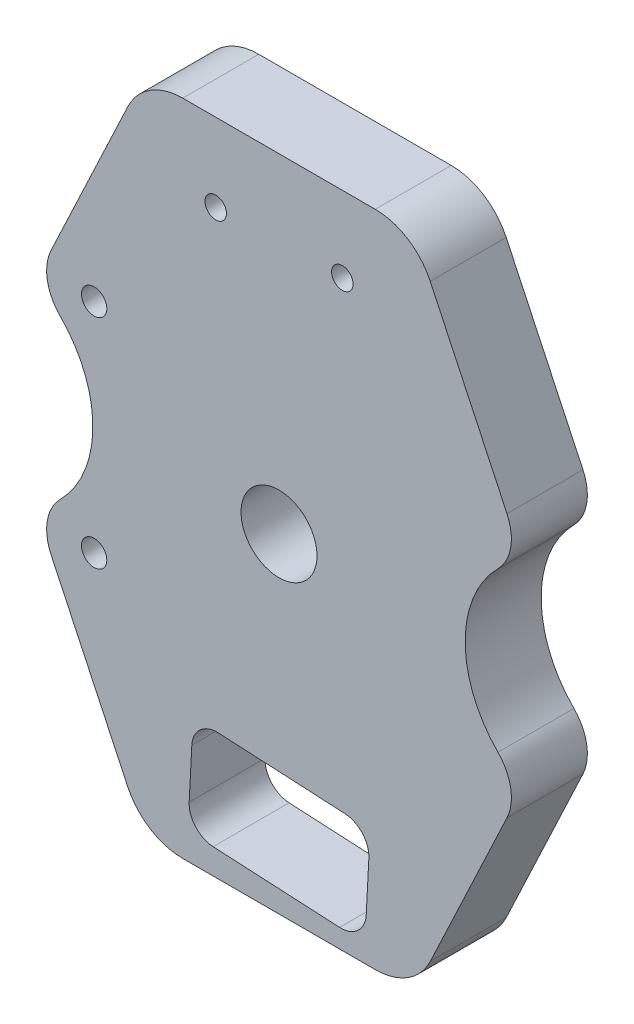
ISO-10303-21;
HEADER;
FILE_DESCRIPTION(('STEP AP214'),'2;1');
FILE_NAME('part.step','',(''),(''),'','','');
FILE_SCHEMA(('AUTOMOTIVE_DESIGN { 1 0 10303 214 1 1 1 1 }'));
ENDSEC;
DATA;
#1=APPLICATION_CONTEXT('core data for automotive mechanical design processes');
#2=APPLICATION_PROTOCOL_DEFINITION('international standard','automotive_design',2000,#1);
#3=PRODUCT_CONTEXT('',#1,'mechanical');
#4=PRODUCT('Part','Part','',(#3));
#5=PRODUCT_RELATED_PRODUCT_CATEGORY('part','',(#4));
#6=PRODUCT_DEFINITION_FORMATION('','',#4);
#7=PRODUCT_DEFINITION_CONTEXT('part definition',#1,'design');
#8=PRODUCT_DEFINITION('design','',#6,#7);
#9=PRODUCT_DEFINITION_SHAPE('','',#8);
#10=(LENGTH_UNIT() NAMED_UNIT(*) SI_UNIT(.MILLI.,.METRE.));
#11=(NAMED_UNIT(*) PLANE_ANGLE_UNIT() SI_UNIT($,.RADIAN.));
#12=(NAMED_UNIT(*) SI_UNIT($,.STERADIAN.) SOLID_ANGLE_UNIT());
#13=UNCERTAINTY_MEASURE_WITH_UNIT(LENGTH_MEASURE(1.E-05),#10,'distance_accuracy_value','');
#14=(GEOMETRIC_REPRESENTATION_CONTEXT(3) GLOBAL_UNCERTAINTY_ASSIGNED_CONTEXT((#13)) GLOBAL_UNIT_ASSIGNED_CONTEXT((#10,
#11,#12)) REPRESENTATION_CONTEXT('',''));
#15=CARTESIAN_POINT('',(0.,0.,0.));
#16=DIRECTION('',(0.,0.,1.));
#17=DIRECTION('',(1.,0.,0.));
#18=AXIS2_PLACEMENT_3D('',#15,#16,#17);
#19=CARTESIAN_POINT('',(38.0693004201398,23.9998999467089,30.));
#20=DIRECTION('',(0.,0.,-1.));
#21=DIRECTION('',(-1.,0.,0.));
#22=AXIS2_PLACEMENT_3D('',#19,#20,#21);
#23=PLANE('',#22);
#24=DIRECTION('',(-0.998629534754574,0.0523359562429441,0.));
#25=VECTOR('',#24,1.);
#26=CARTESIAN_POINT('',(-35.998752841269,10.5489732913392,30.));
#27=LINE('',#26,#25);
#28=CARTESIAN_POINT('',(23.9190192440055,7.4088159167626,30.));
#29=VERTEX_POINT('',#28);
#30=CARTESIAN_POINT('',(-26.0124574937233,10.0256137289098,30.));
#31=VERTEX_POINT('',#30);
#32=EDGE_CURVE('E376',#29,#31,#27,.T.);
#33=ORIENTED_EDGE('',*,*,#32,.T.);
#34=CARTESIAN_POINT('',(-25.4890979312938,20.0119090764555,30.));
#35=DIRECTION('',(0.,0.,-1.));
#36=DIRECTION('',(-1.,0.,0.));
#37=AXIS2_PLACEMENT_3D('',#34,#35,#36);
#38=CIRCLE('',#37,10.);
#39=CARTESIAN_POINT('',(-35.4753932788395,20.535268638885,30.));
#40=VERTEX_POINT('',#39);
#41=EDGE_CURVE('E349',#31,#40,#38,.T.);
#42=ORIENTED_EDGE('',*,*,#41,.T.);
#43=DIRECTION('',(0.0523359562429445,0.998629534754574,0.));
#44=VECTOR('',#43,1.);
#45=CARTESIAN_POINT('',(-33.9053145915512,50.4941546815222,30.));
#46=LINE('',#45,#44);
#47=CARTESIAN_POINT('',(-34.4286741539807,40.5078593339764,30.));
#48=VERTEX_POINT('',#47);
#49=EDGE_CURVE('E378',#40,#48,#46,.T.);
#50=ORIENTED_EDGE('',*,*,#49,.T.);
#51=CARTESIAN_POINT('',(-24.4423788064349,39.984499771547,30.));
#52=DIRECTION('',(0.,0.,-1.));
#53=DIRECTION('',(-1.,0.,0.));
#54=AXIS2_PLACEMENT_3D('',#51,#52,#53);
#55=CIRCLE('',#54,10.);
#56=CARTESIAN_POINT('',(-23.9190192440055,49.9707951190927,30.));
#57=VERTEX_POINT('',#56);
#58=EDGE_CURVE('E56',#48,#57,#55,.T.);
#59=ORIENTED_EDGE('',*,*,#58,.T.);
#60=DIRECTION('',(0.998629534754574,-0.0523359562429446,0.));
#61=VECTOR('',#60,1.);
#62=CARTESIAN_POINT('',(35.998752841269,46.830637744516,30.));
#63=LINE('',#62,#61);
#64=CARTESIAN_POINT('',(26.0124574937232,47.3539973069455,30.));
#65=VERTEX_POINT('',#64);
#66=EDGE_CURVE('E372',#57,#65,#63,.T.);
#67=ORIENTED_EDGE('',*,*,#66,.T.);
#68=CARTESIAN_POINT('',(25.4890979312938,37.3677019593998,30.));
#69=DIRECTION('',(0.,0.,-1.));
#70=DIRECTION('',(-1.,0.,0.));
#71=AXIS2_PLACEMENT_3D('',#68,#69,#70);
#72=CIRCLE('',#71,10.);
#73=CARTESIAN_POINT('',(35.4753932788395,36.8443423969703,30.));
#74=VERTEX_POINT('',#73);
#75=EDGE_CURVE('E11',#65,#74,#72,.T.);
#76=ORIENTED_EDGE('',*,*,#75,.T.);
#77=DIRECTION('',(-0.0523359562429445,-0.998629534754574,0.));
#78=VECTOR('',#77,1.);
#79=CARTESIAN_POINT('',(35.998752841269,46.830637744516,30.));
#80=LINE('',#79,#78);
#81=CARTESIAN_POINT('',(34.4286741539806,16.8717517018789,30.));
#82=VERTEX_POINT('',#81);
#83=EDGE_CURVE('E370',#74,#82,#80,.T.);
#84=ORIENTED_EDGE('',*,*,#83,.T.);
#85=CARTESIAN_POINT('',(24.4423788064349,17.3951112643083,30.));
#86=DIRECTION('',(0.,0.,-1.));
#87=DIRECTION('',(-1.,0.,0.));
#88=AXIS2_PLACEMENT_3D('',#85,#86,#87);
#89=CIRCLE('',#88,10.);
#90=EDGE_CURVE('E345',#82,#29,#89,.T.);
#91=ORIENTED_EDGE('',*,*,#90,.T.);
#92=EDGE_LOOP('',(#33,#42,#50,#59,#67,#76,#84,#91));
#93=FACE_BOUND('',#92,.T.);
#94=DIRECTION('',(1.,-1.29580053179329E-13,0.));
#95=VECTOR('',#94,1.);
#96=CARTESIAN_POINT('',(-38.,4.92404202081449E-12,30.));
#97=LINE('',#96,#95);
#98=CARTESIAN_POINT('',(-38.,5.25274268525777E-12,30.));
#99=VERTEX_POINT('',#98);
#100=CARTESIAN_POINT('',(38.0000000000001,5.61581336988582E-12,30.));
#101=VERTEX_POINT('',#100);
#102=EDGE_CURVE('E195',#99,#101,#97,.T.);
#103=ORIENTED_EDGE('',*,*,#102,.T.);
#104=CARTESIAN_POINT('',(38.0693004201398,23.9998999467089,30.));
#105=DIRECTION('',(0.,0.,1.));
#106=DIRECTION('',(-1.,0.,0.));
#107=AXIS2_PLACEMENT_3D('',#104,#105,#106);
#108=CIRCLE('',#107,24.);
#109=CARTESIAN_POINT('',(59.7661609006696,13.7409406774445,30.));
#110=VERTEX_POINT('',#109);
#111=EDGE_CURVE('E199',#101,#110,#108,.T.);
#112=ORIENTED_EDGE('',*,*,#111,.T.);
#113=DIRECTION('',(0.426346779523004,0.904559795475326,0.));
#114=VECTOR('',#113,1.);
#115=CARTESIAN_POINT('',(59.7661609006696,13.7409406774445,30.));
#116=LINE('',#115,#114);
#117=CARTESIAN_POINT('',(90.0082162674247,77.904079068946,30.));
#118=VERTEX_POINT('',#117);
#119=EDGE_CURVE('E220',#110,#118,#116,.T.);
#120=ORIENTED_EDGE('',*,*,#119,.T.);
#121=CARTESIAN_POINT('',(73.5,85.6849077952408,30.));
#122=DIRECTION('',(0.,0.,1.));
#123=DIRECTION('',(-1.,0.,0.));
#124=AXIS2_PLACEMENT_3D('',#121,#122,#123);
#125=CIRCLE('',#124,18.25);
#126=CARTESIAN_POINT('',(86.4422244101156,98.5519714586494,30.));
#127=VERTEX_POINT('',#126);
#128=EDGE_CURVE('E222',#118,#127,#125,.T.);
#129=ORIENTED_EDGE('',*,*,#128,.T.);
#130=CARTESIAN_POINT('',(117.999977081356,129.926455459837,30.));
#131=DIRECTION('',(0.,0.,-1.));
#132=DIRECTION('',(1.,0.,0.));
#133=AXIS2_PLACEMENT_3D('',#130,#131,#132);
#134=CIRCLE('',#133,44.5);
#135=CARTESIAN_POINT('',(86.4422244101156,161.300939461025,30.));
#136=VERTEX_POINT('',#135);
#137=EDGE_CURVE('E227',#127,#136,#134,.T.);
#138=ORIENTED_EDGE('',*,*,#137,.T.);
#139=CARTESIAN_POINT('',(73.5,174.168003124434,30.));
#140=DIRECTION('',(0.,0.,1.));
#141=DIRECTION('',(1.,0.,0.));
#142=AXIS2_PLACEMENT_3D('',#139,#140,#141);
#143=CIRCLE('',#142,18.25);
#144=CARTESIAN_POINT('',(90.0082162674247,181.948831850729,30.));
#145=VERTEX_POINT('',#144);
#146=EDGE_CURVE('E229',#136,#145,#143,.T.);
#147=ORIENTED_EDGE('',*,*,#146,.T.);
#148=DIRECTION('',(-0.426346779523004,0.904559795475326,0.));
#149=VECTOR('',#148,1.);
#150=CARTESIAN_POINT('',(59.7094350914078,246.232322708552,30.));
#151=LINE('',#150,#149);
#152=CARTESIAN_POINT('',(59.7094350914078,246.232322708552,30.));
#153=VERTEX_POINT('',#152);
#154=EDGE_CURVE('E231',#145,#153,#151,.T.);
#155=ORIENTED_EDGE('',*,*,#154,.T.);
#156=CARTESIAN_POINT('',(38.,236.,30.));
#157=DIRECTION('',(0.,0.,1.));
#158=DIRECTION('',(1.,0.,0.));
#159=AXIS2_PLACEMENT_3D('',#156,#157,#158);
#160=CIRCLE('',#159,24.);
#161=CARTESIAN_POINT('',(38.,260.,30.));
#162=VERTEX_POINT('',#161);
#163=EDGE_CURVE('E233',#153,#162,#160,.T.);
#164=ORIENTED_EDGE('',*,*,#163,.T.);
#165=DIRECTION('',(-1.,0.,0.));
#166=VECTOR('',#165,1.);
#167=CARTESIAN_POINT('',(-38.,260.,30.));
#168=LINE('',#167,#166);
#169=CARTESIAN_POINT('',(-38.,260.,30.));
#170=VERTEX_POINT('',#169);
#171=EDGE_CURVE('E235',#162,#170,#168,.T.);
#172=ORIENTED_EDGE('',*,*,#171,.T.);
#173=CARTESIAN_POINT('',(-38.,236.,30.));
#174=DIRECTION('',(0.,0.,1.));
#175=DIRECTION('',(-1.,0.,0.));
#176=AXIS2_PLACEMENT_3D('',#173,#174,#175);
#177=CIRCLE('',#176,24.);
#178=CARTESIAN_POINT('',(-59.7094350914078,246.232322708552,30.));
#179=VERTEX_POINT('',#178);
#180=EDGE_CURVE('E237',#170,#179,#177,.T.);
#181=ORIENTED_EDGE('',*,*,#180,.T.);
#182=DIRECTION('',(-0.426346779523004,-0.904559795475326,0.));
#183=VECTOR('',#182,1.);
#184=CARTESIAN_POINT('',(-59.7094350914078,246.232322708552,30.));
#185=LINE('',#184,#183);
#186=CARTESIAN_POINT('',(-90.0082162674247,181.948831850729,30.));
#187=VERTEX_POINT('',#186);
#188=EDGE_CURVE('E239',#179,#187,#185,.T.);
#189=ORIENTED_EDGE('',*,*,#188,.T.);
#190=CARTESIAN_POINT('',(-73.5,174.168003124434,30.));
#191=DIRECTION('',(0.,0.,1.));
#192=DIRECTION('',(-1.,0.,0.));
#193=AXIS2_PLACEMENT_3D('',#190,#191,#192);
#194=CIRCLE('',#193,18.25);
#195=CARTESIAN_POINT('',(-86.4422244101156,161.300939461025,30.));
#196=VERTEX_POINT('',#195);
#197=EDGE_CURVE('E241',#187,#196,#194,.T.);
#198=ORIENTED_EDGE('',*,*,#197,.T.);
#199=CARTESIAN_POINT('',(-117.999977081356,129.926455459837,30.));
#200=DIRECTION('',(0.,0.,-1.));
#201=DIRECTION('',(-1.,0.,0.));
#202=AXIS2_PLACEMENT_3D('',#199,#200,#201);
#203=CIRCLE('',#202,44.5);
#204=CARTESIAN_POINT('',(-86.4422244101156,98.5519714586494,30.));
#205=VERTEX_POINT('',#204);
#206=EDGE_CURVE('E243',#196,#205,#203,.T.);
#207=ORIENTED_EDGE('',*,*,#206,.T.);
#208=CARTESIAN_POINT('',(-73.5,85.6849077952408,30.));
#209=DIRECTION('',(0.,0.,1.));
#210=DIRECTION('',(1.,0.,0.));
#211=AXIS2_PLACEMENT_3D('',#208,#209,#210);
#212=CIRCLE('',#211,18.25);
#213=CARTESIAN_POINT('',(-90.0082162674247,77.904079068946,30.));
#214=VERTEX_POINT('',#213);
#215=EDGE_CURVE('E245',#205,#214,#212,.T.);
#216=ORIENTED_EDGE('',*,*,#215,.T.);
#217=DIRECTION('',(0.426346779523004,-0.904559795475326,0.));
#218=VECTOR('',#217,1.);
#219=CARTESIAN_POINT('',(-59.7661609006695,13.7409406774445,30.));
#220=LINE('',#219,#218);
#221=CARTESIAN_POINT('',(-59.7661609006695,13.7409406774445,30.));
#222=VERTEX_POINT('',#221);
#223=EDGE_CURVE('E247',#214,#222,#220,.T.);
#224=ORIENTED_EDGE('',*,*,#223,.T.);
#225=CARTESIAN_POINT('',(-38.0693004201397,23.9998999467089,30.));
#226=DIRECTION('',(0.,0.,1.));
#227=DIRECTION('',(1.,0.,0.));
#228=AXIS2_PLACEMENT_3D('',#225,#226,#227);
#229=CIRCLE('',#228,24.0000000000003);
#230=EDGE_CURVE('E202',#222,#99,#229,.T.);
#231=ORIENTED_EDGE('',*,*,#230,.T.);
#232=EDGE_LOOP('',(#103,#112,#120,#129,#138,#147,#155,#164,#172,#181,#189,#198,#207,#216,#224,#231));
#233=FACE_BOUND('',#232,.T.);
#234=CARTESIAN_POINT('',(0.,130.,30.));
#235=DIRECTION('',(0.,0.,1.));
#236=DIRECTION('',(1.,0.,0.));
#237=AXIS2_PLACEMENT_3D('',#234,#235,#236);
#238=CIRCLE('',#237,15.);
#239=CARTESIAN_POINT('',(15.,130.,30.));
#240=VERTEX_POINT('',#239);
#241=EDGE_CURVE('E253',#240,#240,#238,.T.);
#242=ORIENTED_EDGE('',*,*,#241,.F.);
#243=EDGE_LOOP('',(#242));
#244=FACE_BOUND('',#243,.T.);
#245=CARTESIAN_POINT('',(-73.,173.,30.));
#246=DIRECTION('',(0.,0.,1.));
#247=DIRECTION('',(-1.,0.,0.));
#248=AXIS2_PLACEMENT_3D('',#245,#246,#247);
#249=CIRCLE('',#248,5.00000000000001);
#250=CARTESIAN_POINT('',(-78.,173.,30.));
#251=VERTEX_POINT('',#250);
#252=EDGE_CURVE('E409',#251,#251,#249,.T.);
#253=ORIENTED_EDGE('',*,*,#252,.F.);
#254=EDGE_LOOP('',(#253));
#255=FACE_BOUND('',#254,.T.);
#256=CARTESIAN_POINT('',(-73.,87.,30.));
#257=DIRECTION('',(0.,0.,1.));
#258=DIRECTION('',(1.,0.,0.));
#259=AXIS2_PLACEMENT_3D('',#256,#257,#258);
#260=CIRCLE('',#259,5.00000000000001);
#261=CARTESIAN_POINT('',(-68.,87.,30.));
#262=VERTEX_POINT('',#261);
#263=EDGE_CURVE('E403',#262,#262,#260,.T.);
#264=ORIENTED_EDGE('',*,*,#263,.F.);
#265=EDGE_LOOP('',(#264));
#266=FACE_BOUND('',#265,.T.);
#267=CARTESIAN_POINT('',(-24.9923847578196,229.127379678136,30.));
#268=DIRECTION('',(0.,0.,1.));
#269=DIRECTION('',(1.,0.,0.));
#270=AXIS2_PLACEMENT_3D('',#267,#268,#269);
#271=CIRCLE('',#270,4.25);
#272=CARTESIAN_POINT('',(-20.7423847578196,229.127379678136,30.));
#273=VERTEX_POINT('',#272);
#274=EDGE_CURVE('E397',#273,#273,#271,.T.);
#275=ORIENTED_EDGE('',*,*,#274,.F.);
#276=EDGE_LOOP('',(#275));
#277=FACE_BOUND('',#276,.T.);
#278=CARTESIAN_POINT('',(25.,230.,30.));
#279=DIRECTION('',(0.,0.,1.));
#280=DIRECTION('',(1.,0.,0.));
#281=AXIS2_PLACEMENT_3D('',#278,#279,#280);
#282=CIRCLE('',#281,4.25);
#283=CARTESIAN_POINT('',(29.25,230.,30.));
#284=VERTEX_POINT('',#283);
#285=EDGE_CURVE('E391',#284,#284,#282,.T.);
#286=ORIENTED_EDGE('',*,*,#285,.F.);
#287=EDGE_LOOP('',(#286));
#288=FACE_BOUND('',#287,.T.);
#289=ADVANCED_FACE('F34',(#93,#233,#244,#255,#266,#277,#288),#23,.F.);
#290=CARTESIAN_POINT('',(38.0693004201398,23.9998999467089,0.));
#291=DIRECTION('',(0.,0.,-1.));
#292=DIRECTION('',(-1.,0.,0.));
#293=AXIS2_PLACEMENT_3D('',#290,#291,#292);
#294=PLANE('',#293);
#295=DIRECTION('',(0.998629534754574,-0.0523359562429446,0.));
#296=VECTOR('',#295,1.);
#297=CARTESIAN_POINT('',(35.998752841269,46.830637744516,0.));
#298=LINE('',#297,#296);
#299=CARTESIAN_POINT('',(-23.9190192440055,49.9707951190927,0.));
#300=VERTEX_POINT('',#299);
#301=CARTESIAN_POINT('',(26.0124574937232,47.3539973069455,0.));
#302=VERTEX_POINT('',#301);
#303=EDGE_CURVE('E358',#300,#302,#298,.T.);
#304=ORIENTED_EDGE('',*,*,#303,.F.);
#305=CARTESIAN_POINT('',(-24.4423788064349,39.984499771547,0.));
#306=DIRECTION('',(0.,0.,-1.));
#307=DIRECTION('',(-1.,0.,0.));
#308=AXIS2_PLACEMENT_3D('',#305,#306,#307);
#309=CIRCLE('',#308,10.);
#310=CARTESIAN_POINT('',(-34.4286741539807,40.5078593339764,0.));
#311=VERTEX_POINT('',#310);
#312=EDGE_CURVE('E351',#300,#311,#309,.F.);
#313=ORIENTED_EDGE('',*,*,#312,.T.);
#314=DIRECTION('',(0.0523359562429445,0.998629534754574,0.));
#315=VECTOR('',#314,1.);
#316=CARTESIAN_POINT('',(-33.9053145915512,50.4941546815222,0.));
#317=LINE('',#316,#315);
#318=CARTESIAN_POINT('',(-35.4753932788395,20.535268638885,0.));
#319=VERTEX_POINT('',#318);
#320=EDGE_CURVE('E380',#319,#311,#317,.T.);
#321=ORIENTED_EDGE('',*,*,#320,.F.);
#322=CARTESIAN_POINT('',(-25.4890979312938,20.0119090764555,0.));
#323=DIRECTION('',(0.,0.,-1.));
#324=DIRECTION('',(-1.,0.,0.));
#325=AXIS2_PLACEMENT_3D('',#322,#323,#324);
#326=CIRCLE('',#325,10.);
#327=CARTESIAN_POINT('',(-26.0124574937233,10.0256137289098,0.));
#328=VERTEX_POINT('',#327);
#329=EDGE_CURVE('E347',#319,#328,#326,.F.);
#330=ORIENTED_EDGE('',*,*,#329,.T.);
#331=DIRECTION('',(-0.998629534754574,0.0523359562429441,0.));
#332=VECTOR('',#331,1.);
#333=CARTESIAN_POINT('',(-35.998752841269,10.5489732913392,0.));
#334=LINE('',#333,#332);
#335=CARTESIAN_POINT('',(23.9190192440055,7.4088159167626,0.));
#336=VERTEX_POINT('',#335);
#337=EDGE_CURVE('E386',#336,#328,#334,.T.);
#338=ORIENTED_EDGE('',*,*,#337,.F.);
#339=CARTESIAN_POINT('',(24.4423788064349,17.3951112643083,0.));
#340=DIRECTION('',(0.,0.,-1.));
#341=DIRECTION('',(-1.,0.,0.));
#342=AXIS2_PLACEMENT_3D('',#339,#340,#341);
#343=CIRCLE('',#342,10.);
#344=CARTESIAN_POINT('',(34.4286741539806,16.8717517018789,0.));
#345=VERTEX_POINT('',#344);
#346=EDGE_CURVE('E343',#336,#345,#343,.F.);
#347=ORIENTED_EDGE('',*,*,#346,.T.);
#348=DIRECTION('',(-0.0523359562429445,-0.998629534754574,0.));
#349=VECTOR('',#348,1.);
#350=CARTESIAN_POINT('',(35.998752841269,46.830637744516,0.));
#351=LINE('',#350,#349);
#352=CARTESIAN_POINT('',(35.4753932788395,36.8443423969703,0.));
#353=VERTEX_POINT('',#352);
#354=EDGE_CURVE('E360',#353,#345,#351,.T.);
#355=ORIENTED_EDGE('',*,*,#354,.F.);
#356=CARTESIAN_POINT('',(25.4890979312938,37.3677019593998,0.));
#357=DIRECTION('',(0.,0.,-1.));
#358=DIRECTION('',(-1.,0.,0.));
#359=AXIS2_PLACEMENT_3D('',#356,#357,#358);
#360=CIRCLE('',#359,10.);
#361=EDGE_CURVE('E42',#353,#302,#360,.F.);
#362=ORIENTED_EDGE('',*,*,#361,.T.);
#363=EDGE_LOOP('',(#304,#313,#321,#330,#338,#347,#355,#362));
#364=FACE_BOUND('',#363,.T.);
#365=CARTESIAN_POINT('',(-24.9923847578196,229.127379678136,0.));
#366=DIRECTION('',(0.,0.,1.));
#367=DIRECTION('',(1.,0.,0.));
#368=AXIS2_PLACEMENT_3D('',#365,#366,#367);
#369=CIRCLE('',#368,4.25);
#370=CARTESIAN_POINT('',(-20.7423847578196,229.127379678136,0.));
#371=VERTEX_POINT('',#370);
#372=EDGE_CURVE('E394',#371,#371,#369,.T.);
#373=ORIENTED_EDGE('',*,*,#372,.T.);
#374=EDGE_LOOP('',(#373));
#375=FACE_BOUND('',#374,.T.);
#376=CARTESIAN_POINT('',(-73.,173.,0.));
#377=DIRECTION('',(0.,0.,1.));
#378=DIRECTION('',(-1.,0.,0.));
#379=AXIS2_PLACEMENT_3D('',#376,#377,#378);
#380=CIRCLE('',#379,5.00000000000001);
#381=CARTESIAN_POINT('',(-78.,173.,0.));
#382=VERTEX_POINT('',#381);
#383=EDGE_CURVE('E406',#382,#382,#380,.T.);
#384=ORIENTED_EDGE('',*,*,#383,.T.);
#385=EDGE_LOOP('',(#384));
#386=FACE_BOUND('',#385,.T.);
#387=DIRECTION('',(1.,1.47784562365416E-13,0.));
#388=VECTOR('',#387,1.);
#389=CARTESIAN_POINT('',(0.,0.,0.));
#390=LINE('',#389,#388);
#391=CARTESIAN_POINT('',(-38.,5.25274268525777E-12,0.));
#392=VERTEX_POINT('',#391);
#393=CARTESIAN_POINT('',(38.0000000000001,5.61581336988582E-12,0.));
#394=VERTEX_POINT('',#393);
#395=EDGE_CURVE('E211',#392,#394,#390,.T.);
#396=ORIENTED_EDGE('',*,*,#395,.F.);
#397=CARTESIAN_POINT('',(-38.0693004201397,23.9998999467089,0.));
#398=DIRECTION('',(0.,0.,1.));
#399=DIRECTION('',(1.,0.,0.));
#400=AXIS2_PLACEMENT_3D('',#397,#398,#399);
#401=CIRCLE('',#400,24.0000000000003);
#402=CARTESIAN_POINT('',(-59.7661609006695,13.7409406774445,0.));
#403=VERTEX_POINT('',#402);
#404=EDGE_CURVE('E206',#403,#392,#401,.T.);
#405=ORIENTED_EDGE('',*,*,#404,.F.);
#406=DIRECTION('',(0.426346779523004,-0.904559795475326,0.));
#407=VECTOR('',#406,1.);
#408=CARTESIAN_POINT('',(-59.7661609006695,13.7409406774445,0.));
#409=LINE('',#408,#407);
#410=CARTESIAN_POINT('',(-90.0082162674247,77.904079068946,0.));
#411=VERTEX_POINT('',#410);
#412=EDGE_CURVE('E279',#411,#403,#409,.T.);
#413=ORIENTED_EDGE('',*,*,#412,.F.);
#414=CARTESIAN_POINT('',(-73.5,85.6849077952408,0.));
#415=DIRECTION('',(0.,0.,1.));
#416=DIRECTION('',(1.,0.,0.));
#417=AXIS2_PLACEMENT_3D('',#414,#415,#416);
#418=CIRCLE('',#417,18.25);
#419=CARTESIAN_POINT('',(-86.4422244101156,98.5519714586494,0.));
#420=VERTEX_POINT('',#419);
#421=EDGE_CURVE('E277',#420,#411,#418,.T.);
#422=ORIENTED_EDGE('',*,*,#421,.F.);
#423=CARTESIAN_POINT('',(-117.999977081356,129.926455459837,0.));
#424=DIRECTION('',(0.,0.,-1.));
#425=DIRECTION('',(-1.,0.,0.));
#426=AXIS2_PLACEMENT_3D('',#423,#424,#425);
#427=CIRCLE('',#426,44.5);
#428=CARTESIAN_POINT('',(-86.4422244101156,161.300939461025,0.));
#429=VERTEX_POINT('',#428);
#430=EDGE_CURVE('E275',#429,#420,#427,.T.);
#431=ORIENTED_EDGE('',*,*,#430,.F.);
#432=CARTESIAN_POINT('',(-73.5,174.168003124434,0.));
#433=DIRECTION('',(0.,0.,1.));
#434=DIRECTION('',(-1.,0.,0.));
#435=AXIS2_PLACEMENT_3D('',#432,#433,#434);
#436=CIRCLE('',#435,18.25);
#437=CARTESIAN_POINT('',(-90.0082162674247,181.948831850729,0.));
#438=VERTEX_POINT('',#437);
#439=EDGE_CURVE('E273',#438,#429,#436,.T.);
#440=ORIENTED_EDGE('',*,*,#439,.F.);
#441=DIRECTION('',(-0.426346779523004,-0.904559795475326,0.));
#442=VECTOR('',#441,1.);
#443=CARTESIAN_POINT('',(-59.7094350914078,246.232322708552,0.));
#444=LINE('',#443,#442);
#445=CARTESIAN_POINT('',(-59.7094350914078,246.232322708552,0.));
#446=VERTEX_POINT('',#445);
#447=EDGE_CURVE('E271',#446,#438,#444,.T.);
#448=ORIENTED_EDGE('',*,*,#447,.F.);
#449=CARTESIAN_POINT('',(-38.,236.,0.));
#450=DIRECTION('',(0.,0.,1.));
#451=DIRECTION('',(-1.,0.,0.));
#452=AXIS2_PLACEMENT_3D('',#449,#450,#451);
#453=CIRCLE('',#452,24.);
#454=CARTESIAN_POINT('',(-38.,260.,0.));
#455=VERTEX_POINT('',#454);
#456=EDGE_CURVE('E269',#455,#446,#453,.T.);
#457=ORIENTED_EDGE('',*,*,#456,.F.);
#458=DIRECTION('',(-1.,0.,0.));
#459=VECTOR('',#458,1.);
#460=CARTESIAN_POINT('',(-38.,260.,0.));
#461=LINE('',#460,#459);
#462=CARTESIAN_POINT('',(38.,260.,0.));
#463=VERTEX_POINT('',#462);
#464=EDGE_CURVE('E267',#463,#455,#461,.T.);
#465=ORIENTED_EDGE('',*,*,#464,.F.);
#466=CARTESIAN_POINT('',(38.,236.,0.));
#467=DIRECTION('',(0.,0.,1.));
#468=DIRECTION('',(1.,0.,0.));
#469=AXIS2_PLACEMENT_3D('',#466,#467,#468);
#470=CIRCLE('',#469,24.);
#471=CARTESIAN_POINT('',(59.7094350914078,246.232322708552,0.));
#472=VERTEX_POINT('',#471);
#473=EDGE_CURVE('E265',#472,#463,#470,.T.);
#474=ORIENTED_EDGE('',*,*,#473,.F.);
#475=DIRECTION('',(-0.426346779523004,0.904559795475326,0.));
#476=VECTOR('',#475,1.);
#477=CARTESIAN_POINT('',(59.7094350914078,246.232322708552,0.));
#478=LINE('',#477,#476);
#479=CARTESIAN_POINT('',(90.0082162674247,181.948831850729,0.));
#480=VERTEX_POINT('',#479);
#481=EDGE_CURVE('E263',#480,#472,#478,.T.);
#482=ORIENTED_EDGE('',*,*,#481,.F.);
#483=CARTESIAN_POINT('',(73.5,174.168003124434,0.));
#484=DIRECTION('',(0.,0.,1.));
#485=DIRECTION('',(1.,0.,0.));
#486=AXIS2_PLACEMENT_3D('',#483,#484,#485);
#487=CIRCLE('',#486,18.25);
#488=CARTESIAN_POINT('',(86.4422244101156,161.300939461025,0.));
#489=VERTEX_POINT('',#488);
#490=EDGE_CURVE('E261',#489,#480,#487,.T.);
#491=ORIENTED_EDGE('',*,*,#490,.F.);
#492=CARTESIAN_POINT('',(117.999977081356,129.926455459837,0.));
#493=DIRECTION('',(0.,0.,-1.));
#494=DIRECTION('',(1.,0.,0.));
#495=AXIS2_PLACEMENT_3D('',#492,#493,#494);
#496=CIRCLE('',#495,44.5);
#497=CARTESIAN_POINT('',(86.4422244101156,98.5519714586494,0.));
#498=VERTEX_POINT('',#497);
#499=EDGE_CURVE('E259',#498,#489,#496,.T.);
#500=ORIENTED_EDGE('',*,*,#499,.F.);
#501=CARTESIAN_POINT('',(73.5,85.6849077952408,0.));
#502=DIRECTION('',(0.,0.,1.));
#503=DIRECTION('',(-1.,0.,0.));
#504=AXIS2_PLACEMENT_3D('',#501,#502,#503);
#505=CIRCLE('',#504,18.25);
#506=CARTESIAN_POINT('',(90.0082162674247,77.904079068946,0.));
#507=VERTEX_POINT('',#506);
#508=EDGE_CURVE('E257',#507,#498,#505,.T.);
#509=ORIENTED_EDGE('',*,*,#508,.F.);
#510=DIRECTION('',(0.426346779523004,0.904559795475326,0.));
#511=VECTOR('',#510,1.);
#512=CARTESIAN_POINT('',(59.7661609006696,13.7409406774445,0.));
#513=LINE('',#512,#511);
#514=CARTESIAN_POINT('',(59.7661609006696,13.7409406774445,0.));
#515=VERTEX_POINT('',#514);
#516=EDGE_CURVE('E255',#515,#507,#513,.T.);
#517=ORIENTED_EDGE('',*,*,#516,.F.);
#518=CARTESIAN_POINT('',(38.0693004201398,23.9998999467089,0.));
#519=DIRECTION('',(0.,0.,1.));
#520=DIRECTION('',(-1.,0.,0.));
#521=AXIS2_PLACEMENT_3D('',#518,#519,#520);
#522=CIRCLE('',#521,24.);
#523=EDGE_CURVE('E252',#394,#515,#522,.T.);
#524=ORIENTED_EDGE('',*,*,#523,.F.);
#525=EDGE_LOOP('',(#396,#405,#413,#422,#431,#440,#448,#457,#465,#474,#482,#491,#500,#509,#517,#524));
#526=FACE_BOUND('',#525,.T.);
#527=CARTESIAN_POINT('',(0.,130.,0.));
#528=DIRECTION('',(0.,0.,1.));
#529=DIRECTION('',(1.,0.,0.));
#530=AXIS2_PLACEMENT_3D('',#527,#528,#529);
#531=CIRCLE('',#530,15.);
#532=CARTESIAN_POINT('',(15.,130.,0.));
#533=VERTEX_POINT('',#532);
#534=EDGE_CURVE('E412',#533,#533,#531,.T.);
#535=ORIENTED_EDGE('',*,*,#534,.T.);
#536=EDGE_LOOP('',(#535));
#537=FACE_BOUND('',#536,.T.);
#538=CARTESIAN_POINT('',(-73.,87.,0.));
#539=DIRECTION('',(0.,0.,1.));
#540=DIRECTION('',(1.,0.,0.));
#541=AXIS2_PLACEMENT_3D('',#538,#539,#540);
#542=CIRCLE('',#541,5.00000000000001);
#543=CARTESIAN_POINT('',(-68.,87.,0.));
#544=VERTEX_POINT('',#543);
#545=EDGE_CURVE('E400',#544,#544,#542,.T.);
#546=ORIENTED_EDGE('',*,*,#545,.T.);
#547=EDGE_LOOP('',(#546));
#548=FACE_BOUND('',#547,.T.);
#549=CARTESIAN_POINT('',(25.,230.,0.));
#550=DIRECTION('',(0.,0.,1.));
#551=DIRECTION('',(1.,0.,0.));
#552=AXIS2_PLACEMENT_3D('',#549,#550,#551);
#553=CIRCLE('',#552,4.25);
#554=CARTESIAN_POINT('',(29.25,230.,0.));
#555=VERTEX_POINT('',#554);
#556=EDGE_CURVE('E383',#555,#555,#553,.T.);
#557=ORIENTED_EDGE('',*,*,#556,.T.);
#558=EDGE_LOOP('',(#557));
#559=FACE_BOUND('',#558,.T.);
#560=ADVANCED_FACE('F356',(#364,#375,#386,#526,#537,#548,#559),#294,.T.);
#561=CARTESIAN_POINT('',(0.,0.,30.));
#562=DIRECTION('',(-1.47784562365416E-13,1.,0.));
#563=DIRECTION('',(-1.,-1.47784562365416E-13,0.));
#564=AXIS2_PLACEMENT_3D('',#561,#562,#563);
#565=PLANE('',#564);
#566=ORIENTED_EDGE('',*,*,#395,.T.);
#567=DIRECTION('',(0.,0.,-1.));
#568=VECTOR('',#567,1.);
#569=CARTESIAN_POINT('',(38.0000000000001,5.61581336988582E-12,30.));
#570=LINE('',#569,#568);
#571=EDGE_CURVE('E209',#101,#394,#570,.T.);
#572=ORIENTED_EDGE('',*,*,#571,.F.);
#573=ORIENTED_EDGE('',*,*,#102,.F.);
#574=DIRECTION('',(0.,0.,-1.));
#575=VECTOR('',#574,1.);
#576=CARTESIAN_POINT('',(-38.,5.25274268525777E-12,30.));
#577=LINE('',#576,#575);
#578=EDGE_CURVE('E250',#99,#392,#577,.T.);
#579=ORIENTED_EDGE('',*,*,#578,.T.);
#580=EDGE_LOOP('',(#566,#572,#573,#579));
#581=FACE_BOUND('',#580,.T.);
#582=ADVANCED_FACE('F210',(#581),#565,.F.);
#583=CARTESIAN_POINT('',(38.0693004201398,23.9998999467089,30.));
#584=DIRECTION('',(0.,0.,-1.));
#585=DIRECTION('',(-1.,0.,0.));
#586=AXIS2_PLACEMENT_3D('',#583,#584,#585);
#587=CYLINDRICAL_SURFACE('',#586,24.);
#588=ORIENTED_EDGE('',*,*,#523,.T.);
#589=DIRECTION('',(0.,0.,-1.));
#590=VECTOR('',#589,1.);
#591=CARTESIAN_POINT('',(59.7661609006696,13.7409406774445,30.));
#592=LINE('',#591,#590);
#593=EDGE_CURVE('E215',#110,#515,#592,.T.);
#594=ORIENTED_EDGE('',*,*,#593,.F.);
#595=ORIENTED_EDGE('',*,*,#111,.F.);
#596=ORIENTED_EDGE('',*,*,#571,.T.);
#597=EDGE_LOOP('',(#588,#594,#595,#596));
#598=FACE_BOUND('',#597,.T.);
#599=ADVANCED_FACE('F217',(#598),#587,.T.);
#600=CARTESIAN_POINT('',(59.7661609006696,13.7409406774445,30.));
#601=DIRECTION('',(-0.904559795475326,0.426346779523004,0.));
#602=DIRECTION('',(-0.426346779523004,-0.904559795475326,0.));
#603=AXIS2_PLACEMENT_3D('',#600,#601,#602);
#604=PLANE('',#603);
#605=ORIENTED_EDGE('',*,*,#516,.T.);
#606=DIRECTION('',(0.,0.,-1.));
#607=VECTOR('',#606,1.);
#608=CARTESIAN_POINT('',(90.0082162674247,77.904079068946,30.));
#609=LINE('',#608,#607);
#610=EDGE_CURVE('E321',#118,#507,#609,.T.);
#611=ORIENTED_EDGE('',*,*,#610,.F.);
#612=ORIENTED_EDGE('',*,*,#119,.F.);
#613=ORIENTED_EDGE('',*,*,#593,.T.);
#614=EDGE_LOOP('',(#605,#611,#612,#613));
#615=FACE_BOUND('',#614,.T.);
#616=ADVANCED_FACE('F490',(#615),#604,.F.);
#617=CARTESIAN_POINT('',(73.5,85.6849077952408,30.));
#618=DIRECTION('',(0.,0.,-1.));
#619=DIRECTION('',(-1.,0.,0.));
#620=AXIS2_PLACEMENT_3D('',#617,#618,#619);
#621=CYLINDRICAL_SURFACE('',#620,18.25);
#622=ORIENTED_EDGE('',*,*,#508,.T.);
#623=DIRECTION('',(0.,0.,-1.));
#624=VECTOR('',#623,1.);
#625=CARTESIAN_POINT('',(86.4422244101156,98.5519714586494,30.));
#626=LINE('',#625,#624);
#627=EDGE_CURVE('E318',#127,#498,#626,.T.);
#628=ORIENTED_EDGE('',*,*,#627,.F.);
#629=ORIENTED_EDGE('',*,*,#128,.F.);
#630=ORIENTED_EDGE('',*,*,#610,.T.);
#631=EDGE_LOOP('',(#622,#628,#629,#630));
#632=FACE_BOUND('',#631,.T.);
#633=ADVANCED_FACE('F486',(#632),#621,.T.);
#634=CARTESIAN_POINT('',(117.999977081356,129.926455459837,30.));
#635=DIRECTION('',(0.,0.,-1.));
#636=DIRECTION('',(-1.,0.,0.));
#637=AXIS2_PLACEMENT_3D('',#634,#635,#636);
#638=CYLINDRICAL_SURFACE('',#637,44.5);
#639=ORIENTED_EDGE('',*,*,#499,.T.);
#640=DIRECTION('',(0.,0.,-1.));
#641=VECTOR('',#640,1.);
#642=CARTESIAN_POINT('',(86.4422244101156,161.300939461025,30.));
#643=LINE('',#642,#641);
#644=EDGE_CURVE('E315',#136,#489,#643,.T.);
#645=ORIENTED_EDGE('',*,*,#644,.F.);
#646=ORIENTED_EDGE('',*,*,#137,.F.);
#647=ORIENTED_EDGE('',*,*,#627,.T.);
#648=EDGE_LOOP('',(#639,#645,#646,#647));
#649=FACE_BOUND('',#648,.T.);
#650=ADVANCED_FACE('F482',(#649),#638,.F.);
#651=CARTESIAN_POINT('',(73.5,174.168003124434,30.));
#652=DIRECTION('',(0.,0.,-1.));
#653=DIRECTION('',(-1.,0.,0.));
#654=AXIS2_PLACEMENT_3D('',#651,#652,#653);
#655=CYLINDRICAL_SURFACE('',#654,18.25);
#656=ORIENTED_EDGE('',*,*,#490,.T.);
#657=DIRECTION('',(0.,0.,-1.));
#658=VECTOR('',#657,1.);
#659=CARTESIAN_POINT('',(90.0082162674247,181.948831850729,30.));
#660=LINE('',#659,#658);
#661=EDGE_CURVE('E312',#145,#480,#660,.T.);
#662=ORIENTED_EDGE('',*,*,#661,.F.);
#663=ORIENTED_EDGE('',*,*,#146,.F.);
#664=ORIENTED_EDGE('',*,*,#644,.T.);
#665=EDGE_LOOP('',(#656,#662,#663,#664));
#666=FACE_BOUND('',#665,.T.);
#667=ADVANCED_FACE('F478',(#666),#655,.T.);
#668=CARTESIAN_POINT('',(59.7094350914078,246.232322708552,30.));
#669=DIRECTION('',(-0.904559795475326,-0.426346779523004,0.));
#670=DIRECTION('',(0.426346779523004,-0.904559795475326,0.));
#671=AXIS2_PLACEMENT_3D('',#668,#669,#670);
#672=PLANE('',#671);
#673=ORIENTED_EDGE('',*,*,#481,.T.);
#674=DIRECTION('',(0.,0.,-1.));
#675=VECTOR('',#674,1.);
#676=CARTESIAN_POINT('',(59.7094350914078,246.232322708552,30.));
#677=LINE('',#676,#675);
#678=EDGE_CURVE('E309',#153,#472,#677,.T.);
#679=ORIENTED_EDGE('',*,*,#678,.F.);
#680=ORIENTED_EDGE('',*,*,#154,.F.);
#681=ORIENTED_EDGE('',*,*,#661,.T.);
#682=EDGE_LOOP('',(#673,#679,#680,#681));
#683=FACE_BOUND('',#682,.T.);
#684=ADVANCED_FACE('F474',(#683),#672,.F.);
#685=CARTESIAN_POINT('',(38.,236.,30.));
#686=DIRECTION('',(0.,0.,-1.));
#687=DIRECTION('',(-1.,0.,0.));
#688=AXIS2_PLACEMENT_3D('',#685,#686,#687);
#689=CYLINDRICAL_SURFACE('',#688,24.);
#690=ORIENTED_EDGE('',*,*,#473,.T.);
#691=DIRECTION('',(0.,0.,-1.));
#692=VECTOR('',#691,1.);
#693=CARTESIAN_POINT('',(38.,260.,30.));
#694=LINE('',#693,#692);
#695=EDGE_CURVE('E306',#162,#463,#694,.T.);
#696=ORIENTED_EDGE('',*,*,#695,.F.);
#697=ORIENTED_EDGE('',*,*,#163,.F.);
#698=ORIENTED_EDGE('',*,*,#678,.T.);
#699=EDGE_LOOP('',(#690,#696,#697,#698));
#700=FACE_BOUND('',#699,.T.);
#701=ADVANCED_FACE('F470',(#700),#689,.T.);
#702=CARTESIAN_POINT('',(-38.,260.,30.));
#703=DIRECTION('',(0.,-1.,0.));
#704=DIRECTION('',(0.,0.,-1.));
#705=AXIS2_PLACEMENT_3D('',#702,#703,#704);
#706=PLANE('',#705);
#707=ORIENTED_EDGE('',*,*,#464,.T.);
#708=DIRECTION('',(0.,0.,-1.));
#709=VECTOR('',#708,1.);
#710=CARTESIAN_POINT('',(-38.,260.,30.));
#711=LINE('',#710,#709);
#712=EDGE_CURVE('E303',#170,#455,#711,.T.);
#713=ORIENTED_EDGE('',*,*,#712,.F.);
#714=ORIENTED_EDGE('',*,*,#171,.F.);
#715=ORIENTED_EDGE('',*,*,#695,.T.);
#716=EDGE_LOOP('',(#707,#713,#714,#715));
#717=FACE_BOUND('',#716,.T.);
#718=ADVANCED_FACE('F466',(#717),#706,.F.);
#719=CARTESIAN_POINT('',(-38.,236.,30.));
#720=DIRECTION('',(0.,0.,-1.));
#721=DIRECTION('',(-1.,0.,0.));
#722=AXIS2_PLACEMENT_3D('',#719,#720,#721);
#723=CYLINDRICAL_SURFACE('',#722,24.);
#724=ORIENTED_EDGE('',*,*,#456,.T.);
#725=DIRECTION('',(0.,0.,-1.));
#726=VECTOR('',#725,1.);
#727=CARTESIAN_POINT('',(-59.7094350914078,246.232322708552,30.));
#728=LINE('',#727,#726);
#729=EDGE_CURVE('E300',#179,#446,#728,.T.);
#730=ORIENTED_EDGE('',*,*,#729,.F.);
#731=ORIENTED_EDGE('',*,*,#180,.F.);
#732=ORIENTED_EDGE('',*,*,#712,.T.);
#733=EDGE_LOOP('',(#724,#730,#731,#732));
#734=FACE_BOUND('',#733,.T.);
#735=ADVANCED_FACE('F462',(#734),#723,.T.);
#736=CARTESIAN_POINT('',(-59.7094350914078,246.232322708552,30.));
#737=DIRECTION('',(0.904559795475326,-0.426346779523004,0.));
#738=DIRECTION('',(0.426346779523004,0.904559795475326,0.));
#739=AXIS2_PLACEMENT_3D('',#736,#737,#738);
#740=PLANE('',#739);
#741=ORIENTED_EDGE('',*,*,#447,.T.);
#742=DIRECTION('',(0.,0.,-1.));
#743=VECTOR('',#742,1.);
#744=CARTESIAN_POINT('',(-90.0082162674247,181.948831850729,30.));
#745=LINE('',#744,#743);
#746=EDGE_CURVE('E297',#187,#438,#745,.T.);
#747=ORIENTED_EDGE('',*,*,#746,.F.);
#748=ORIENTED_EDGE('',*,*,#188,.F.);
#749=ORIENTED_EDGE('',*,*,#729,.T.);
#750=EDGE_LOOP('',(#741,#747,#748,#749));
#751=FACE_BOUND('',#750,.T.);
#752=ADVANCED_FACE('F458',(#751),#740,.F.);
#753=CARTESIAN_POINT('',(-73.5,174.168003124434,30.));
#754=DIRECTION('',(0.,0.,-1.));
#755=DIRECTION('',(-1.,0.,0.));
#756=AXIS2_PLACEMENT_3D('',#753,#754,#755);
#757=CYLINDRICAL_SURFACE('',#756,18.25);
#758=ORIENTED_EDGE('',*,*,#439,.T.);
#759=DIRECTION('',(0.,0.,-1.));
#760=VECTOR('',#759,1.);
#761=CARTESIAN_POINT('',(-86.4422244101156,161.300939461025,30.));
#762=LINE('',#761,#760);
#763=EDGE_CURVE('E294',#196,#429,#762,.T.);
#764=ORIENTED_EDGE('',*,*,#763,.F.);
#765=ORIENTED_EDGE('',*,*,#197,.F.);
#766=ORIENTED_EDGE('',*,*,#746,.T.);
#767=EDGE_LOOP('',(#758,#764,#765,#766));
#768=FACE_BOUND('',#767,.T.);
#769=ADVANCED_FACE('F454',(#768),#757,.T.);
#770=CARTESIAN_POINT('',(-117.999977081356,129.926455459837,30.));
#771=DIRECTION('',(0.,0.,-1.));
#772=DIRECTION('',(-1.,0.,0.));
#773=AXIS2_PLACEMENT_3D('',#770,#771,#772);
#774=CYLINDRICAL_SURFACE('',#773,44.5);
#775=ORIENTED_EDGE('',*,*,#430,.T.);
#776=DIRECTION('',(0.,0.,-1.));
#777=VECTOR('',#776,1.);
#778=CARTESIAN_POINT('',(-86.4422244101156,98.5519714586494,30.));
#779=LINE('',#778,#777);
#780=EDGE_CURVE('E290',#205,#420,#779,.T.);
#781=ORIENTED_EDGE('',*,*,#780,.F.);
#782=ORIENTED_EDGE('',*,*,#206,.F.);
#783=ORIENTED_EDGE('',*,*,#763,.T.);
#784=EDGE_LOOP('',(#775,#781,#782,#783));
#785=FACE_BOUND('',#784,.T.);
#786=ADVANCED_FACE('F450',(#785),#774,.F.);
#787=CARTESIAN_POINT('',(-73.5,85.6849077952408,30.));
#788=DIRECTION('',(0.,0.,-1.));
#789=DIRECTION('',(-1.,0.,0.));
#790=AXIS2_PLACEMENT_3D('',#787,#788,#789);
#791=CYLINDRICAL_SURFACE('',#790,18.25);
#792=ORIENTED_EDGE('',*,*,#421,.T.);
#793=DIRECTION('',(0.,0.,-1.));
#794=VECTOR('',#793,1.);
#795=CARTESIAN_POINT('',(-90.0082162674247,77.904079068946,30.));
#796=LINE('',#795,#794);
#797=EDGE_CURVE('E287',#214,#411,#796,.T.);
#798=ORIENTED_EDGE('',*,*,#797,.F.);
#799=ORIENTED_EDGE('',*,*,#215,.F.);
#800=ORIENTED_EDGE('',*,*,#780,.T.);
#801=EDGE_LOOP('',(#792,#798,#799,#800));
#802=FACE_BOUND('',#801,.T.);
#803=ADVANCED_FACE('F446',(#802),#791,.T.);
#804=CARTESIAN_POINT('',(-59.7661609006695,13.7409406774445,30.));
#805=DIRECTION('',(0.904559795475326,0.426346779523004,0.));
#806=DIRECTION('',(-0.426346779523004,0.904559795475326,0.));
#807=AXIS2_PLACEMENT_3D('',#804,#805,#806);
#808=PLANE('',#807);
#809=ORIENTED_EDGE('',*,*,#412,.T.);
#810=DIRECTION('',(0.,0.,-1.));
#811=VECTOR('',#810,1.);
#812=CARTESIAN_POINT('',(-59.7661609006695,13.7409406774445,30.));
#813=LINE('',#812,#811);
#814=EDGE_CURVE('E284',#222,#403,#813,.T.);
#815=ORIENTED_EDGE('',*,*,#814,.F.);
#816=ORIENTED_EDGE('',*,*,#223,.F.);
#817=ORIENTED_EDGE('',*,*,#797,.T.);
#818=EDGE_LOOP('',(#809,#815,#816,#817));
#819=FACE_BOUND('',#818,.T.);
#820=ADVANCED_FACE('F434',(#819),#808,.F.);
#821=CARTESIAN_POINT('',(-38.0693004201397,23.9998999467089,30.));
#822=DIRECTION('',(0.,0.,-1.));
#823=DIRECTION('',(-1.,0.,0.));
#824=AXIS2_PLACEMENT_3D('',#821,#822,#823);
#825=CYLINDRICAL_SURFACE('',#824,24.0000000000003);
#826=ORIENTED_EDGE('',*,*,#404,.T.);
#827=ORIENTED_EDGE('',*,*,#578,.F.);
#828=ORIENTED_EDGE('',*,*,#230,.F.);
#829=ORIENTED_EDGE('',*,*,#814,.T.);
#830=EDGE_LOOP('',(#826,#827,#828,#829));
#831=FACE_BOUND('',#830,.T.);
#832=ADVANCED_FACE('F424',(#831),#825,.T.);
#833=CARTESIAN_POINT('',(0.,130.,30.));
#834=DIRECTION('',(0.,0.,-1.));
#835=DIRECTION('',(-1.,0.,0.));
#836=AXIS2_PLACEMENT_3D('',#833,#834,#835);
#837=CYLINDRICAL_SURFACE('',#836,15.);
#838=ORIENTED_EDGE('',*,*,#241,.T.);
#839=EDGE_LOOP('',(#838));
#840=FACE_BOUND('',#839,.T.);
#841=ORIENTED_EDGE('',*,*,#534,.F.);
#842=EDGE_LOOP('',(#841));
#843=FACE_BOUND('',#842,.T.);
#844=ADVANCED_FACE('F421',(#840,#843),#837,.F.);
#845=CARTESIAN_POINT('',(-73.,173.,30.));
#846=DIRECTION('',(0.,0.,-1.));
#847=DIRECTION('',(-1.,0.,0.));
#848=AXIS2_PLACEMENT_3D('',#845,#846,#847);
#849=CYLINDRICAL_SURFACE('',#848,5.00000000000001);
#850=ORIENTED_EDGE('',*,*,#252,.T.);
#851=EDGE_LOOP('',(#850));
#852=FACE_BOUND('',#851,.T.);
#853=ORIENTED_EDGE('',*,*,#383,.F.);
#854=EDGE_LOOP('',(#853));
#855=FACE_BOUND('',#854,.T.);
#856=ADVANCED_FACE('F423',(#852,#855),#849,.F.);
#857=CARTESIAN_POINT('',(-73.,87.,30.));
#858=DIRECTION('',(0.,0.,-1.));
#859=DIRECTION('',(-1.,0.,0.));
#860=AXIS2_PLACEMENT_3D('',#857,#858,#859);
#861=CYLINDRICAL_SURFACE('',#860,5.00000000000001);
#862=ORIENTED_EDGE('',*,*,#263,.T.);
#863=EDGE_LOOP('',(#862));
#864=FACE_BOUND('',#863,.T.);
#865=ORIENTED_EDGE('',*,*,#545,.F.);
#866=EDGE_LOOP('',(#865));
#867=FACE_BOUND('',#866,.T.);
#868=ADVANCED_FACE('F431',(#864,#867),#861,.F.);
#869=CARTESIAN_POINT('',(-24.9923847578196,229.127379678136,30.));
#870=DIRECTION('',(0.,0.,-1.));
#871=DIRECTION('',(-1.,0.,0.));
#872=AXIS2_PLACEMENT_3D('',#869,#870,#871);
#873=CYLINDRICAL_SURFACE('',#872,4.25);
#874=ORIENTED_EDGE('',*,*,#274,.T.);
#875=EDGE_LOOP('',(#874));
#876=FACE_BOUND('',#875,.T.);
#877=ORIENTED_EDGE('',*,*,#372,.F.);
#878=EDGE_LOOP('',(#877));
#879=FACE_BOUND('',#878,.T.);
#880=ADVANCED_FACE('F539',(#876,#879),#873,.F.);
#881=CARTESIAN_POINT('',(25.,230.,30.));
#882=DIRECTION('',(0.,0.,-1.));
#883=DIRECTION('',(-1.,0.,0.));
#884=AXIS2_PLACEMENT_3D('',#881,#882,#883);
#885=CYLINDRICAL_SURFACE('',#884,4.25);
#886=ORIENTED_EDGE('',*,*,#285,.T.);
#887=EDGE_LOOP('',(#886));
#888=FACE_BOUND('',#887,.T.);
#889=ORIENTED_EDGE('',*,*,#556,.F.);
#890=EDGE_LOOP('',(#889));
#891=FACE_BOUND('',#890,.T.);
#892=ADVANCED_FACE('F536',(#888,#891),#885,.F.);
#893=CARTESIAN_POINT('',(35.998752841269,46.830637744516,30.));
#894=DIRECTION('',(0.0523359562429446,0.998629534754574,0.));
#895=DIRECTION('',(-0.998629534754574,0.0523359562429446,0.));
#896=AXIS2_PLACEMENT_3D('',#893,#894,#895);
#897=PLANE('',#896);
#898=ORIENTED_EDGE('',*,*,#66,.F.);
#899=DIRECTION('',(0.,0.,-1.));
#900=VECTOR('',#899,1.);
#901=CARTESIAN_POINT('',(-23.9190192440055,49.9707951190927,0.));
#902=LINE('',#901,#900);
#903=EDGE_CURVE('E340',#57,#300,#902,.T.);
#904=ORIENTED_EDGE('',*,*,#903,.T.);
#905=ORIENTED_EDGE('',*,*,#303,.T.);
#906=DIRECTION('',(0.,0.,-1.));
#907=VECTOR('',#906,1.);
#908=CARTESIAN_POINT('',(26.0124574937232,47.3539973069455,30.));
#909=LINE('',#908,#907);
#910=EDGE_CURVE('E49',#302,#65,#909,.F.);
#911=ORIENTED_EDGE('',*,*,#910,.T.);
#912=EDGE_LOOP('',(#898,#904,#905,#911));
#913=FACE_BOUND('',#912,.T.);
#914=ADVANCED_FACE('F363',(#913),#897,.F.);
#915=CARTESIAN_POINT('',(-33.9053145915512,50.4941546815222,30.));
#916=DIRECTION('',(-0.998629534754574,0.0523359562429445,0.));
#917=DIRECTION('',(-0.0523359562429445,-0.998629534754574,0.));
#918=AXIS2_PLACEMENT_3D('',#915,#916,#917);
#919=PLANE('',#918);
#920=ORIENTED_EDGE('',*,*,#49,.F.);
#921=DIRECTION('',(0.,0.,-1.));
#922=VECTOR('',#921,1.);
#923=CARTESIAN_POINT('',(-35.4753932788395,20.535268638885,0.));
#924=LINE('',#923,#922);
#925=EDGE_CURVE('E336',#40,#319,#924,.T.);
#926=ORIENTED_EDGE('',*,*,#925,.T.);
#927=ORIENTED_EDGE('',*,*,#320,.T.);
#928=DIRECTION('',(0.,0.,-1.));
#929=VECTOR('',#928,1.);
#930=CARTESIAN_POINT('',(-34.4286741539807,40.5078593339764,30.));
#931=LINE('',#930,#929);
#932=EDGE_CURVE('E334',#311,#48,#931,.F.);
#933=ORIENTED_EDGE('',*,*,#932,.T.);
#934=EDGE_LOOP('',(#920,#926,#927,#933));
#935=FACE_BOUND('',#934,.T.);
#936=ADVANCED_FACE('F516',(#935),#919,.F.);
#937=CARTESIAN_POINT('',(-35.998752841269,10.5489732913392,30.));
#938=DIRECTION('',(-0.0523359562429441,-0.998629534754574,0.));
#939=DIRECTION('',(0.998629534754574,-0.0523359562429441,0.));
#940=AXIS2_PLACEMENT_3D('',#937,#938,#939);
#941=PLANE('',#940);
#942=ORIENTED_EDGE('',*,*,#32,.F.);
#943=DIRECTION('',(0.,0.,-1.));
#944=VECTOR('',#943,1.);
#945=CARTESIAN_POINT('',(23.9190192440055,7.4088159167626,0.));
#946=LINE('',#945,#944);
#947=EDGE_CURVE('E326',#29,#336,#946,.T.);
#948=ORIENTED_EDGE('',*,*,#947,.T.);
#949=ORIENTED_EDGE('',*,*,#337,.T.);
#950=DIRECTION('',(0.,0.,-1.));
#951=VECTOR('',#950,1.);
#952=CARTESIAN_POINT('',(-26.0124574937233,10.0256137289098,30.));
#953=LINE('',#952,#951);
#954=EDGE_CURVE('E214',#328,#31,#953,.F.);
#955=ORIENTED_EDGE('',*,*,#954,.T.);
#956=EDGE_LOOP('',(#942,#948,#949,#955));
#957=FACE_BOUND('',#956,.T.);
#958=ADVANCED_FACE('F523',(#957),#941,.F.);
#959=CARTESIAN_POINT('',(35.998752841269,46.830637744516,30.));
#960=DIRECTION('',(0.998629534754574,-0.0523359562429445,0.));
#961=DIRECTION('',(0.0523359562429445,0.998629534754574,0.));
#962=AXIS2_PLACEMENT_3D('',#959,#960,#961);
#963=PLANE('',#962);
#964=ORIENTED_EDGE('',*,*,#354,.T.);
#965=DIRECTION('',(0.,0.,-1.));
#966=VECTOR('',#965,1.);
#967=CARTESIAN_POINT('',(34.4286741539806,16.8717517018789,30.));
#968=LINE('',#967,#966);
#969=EDGE_CURVE('E332',#345,#82,#968,.F.);
#970=ORIENTED_EDGE('',*,*,#969,.T.);
#971=ORIENTED_EDGE('',*,*,#83,.F.);
#972=DIRECTION('',(0.,0.,-1.));
#973=VECTOR('',#972,1.);
#974=CARTESIAN_POINT('',(35.4753932788395,36.8443423969703,0.));
#975=LINE('',#974,#973);
#976=EDGE_CURVE('E329',#74,#353,#975,.T.);
#977=ORIENTED_EDGE('',*,*,#976,.T.);
#978=EDGE_LOOP('',(#964,#970,#971,#977));
#979=FACE_BOUND('',#978,.T.);
#980=ADVANCED_FACE('F374',(#979),#963,.F.);
#981=CARTESIAN_POINT('',(24.4423788064349,17.3951112643083,30.));
#982=DIRECTION('',(0.,0.,1.));
#983=DIRECTION('',(1.,0.,0.));
#984=AXIS2_PLACEMENT_3D('',#981,#982,#983);
#985=CYLINDRICAL_SURFACE('',#984,10.);
#986=ORIENTED_EDGE('',*,*,#90,.F.);
#987=ORIENTED_EDGE('',*,*,#969,.F.);
#988=ORIENTED_EDGE('',*,*,#346,.F.);
#989=ORIENTED_EDGE('',*,*,#947,.F.);
#990=EDGE_LOOP('',(#986,#987,#988,#989));
#991=FACE_BOUND('',#990,.T.);
#992=ADVANCED_FACE('F499',(#991),#985,.F.);
#993=CARTESIAN_POINT('',(-25.4890979312938,20.0119090764555,30.));
#994=DIRECTION('',(0.,0.,1.));
#995=DIRECTION('',(1.,0.,0.));
#996=AXIS2_PLACEMENT_3D('',#993,#994,#995);
#997=CYLINDRICAL_SURFACE('',#996,10.);
#998=ORIENTED_EDGE('',*,*,#41,.F.);
#999=ORIENTED_EDGE('',*,*,#954,.F.);
#1000=ORIENTED_EDGE('',*,*,#329,.F.);
#1001=ORIENTED_EDGE('',*,*,#925,.F.);
#1002=EDGE_LOOP('',(#998,#999,#1000,#1001));
#1003=FACE_BOUND('',#1002,.T.);
#1004=ADVANCED_FACE('F502',(#1003),#997,.F.);
#1005=CARTESIAN_POINT('',(-24.4423788064349,39.984499771547,30.));
#1006=DIRECTION('',(0.,0.,1.));
#1007=DIRECTION('',(1.,0.,0.));
#1008=AXIS2_PLACEMENT_3D('',#1005,#1006,#1007);
#1009=CYLINDRICAL_SURFACE('',#1008,10.);
#1010=ORIENTED_EDGE('',*,*,#58,.F.);
#1011=ORIENTED_EDGE('',*,*,#932,.F.);
#1012=ORIENTED_EDGE('',*,*,#312,.F.);
#1013=ORIENTED_EDGE('',*,*,#903,.F.);
#1014=EDGE_LOOP('',(#1010,#1011,#1012,#1013));
#1015=FACE_BOUND('',#1014,.T.);
#1016=ADVANCED_FACE('F505',(#1015),#1009,.F.);
#1017=CARTESIAN_POINT('',(25.4890979312938,37.3677019593998,30.));
#1018=DIRECTION('',(0.,0.,1.));
#1019=DIRECTION('',(1.,0.,0.));
#1020=AXIS2_PLACEMENT_3D('',#1017,#1018,#1019);
#1021=CYLINDRICAL_SURFACE('',#1020,10.);
#1022=ORIENTED_EDGE('',*,*,#75,.F.);
#1023=ORIENTED_EDGE('',*,*,#910,.F.);
#1024=ORIENTED_EDGE('',*,*,#361,.F.);
#1025=ORIENTED_EDGE('',*,*,#976,.F.);
#1026=EDGE_LOOP('',(#1022,#1023,#1024,#1025));
#1027=FACE_BOUND('',#1026,.T.);
#1028=ADVANCED_FACE('F36',(#1027),#1021,.F.);
#1029=CLOSED_SHELL('',(#289,#560,#582,#599,#616,#633,#650,#667,#684,#701,#718,#735,#752,#769,
#786,#803,#820,#832,#844,#856,#868,#880,#892,#914,#936,#958,#980,#992,#1004,#1016,#1028));
#1030=MANIFOLD_SOLID_BREP('B2',#1029);
#1031=ADVANCED_BREP_SHAPE_REPRESENTATION('',(#18,#1030),#14);
#1032=SHAPE_DEFINITION_REPRESENTATION(#9,#1031);
ENDSEC;
END-ISO-10303-21;
